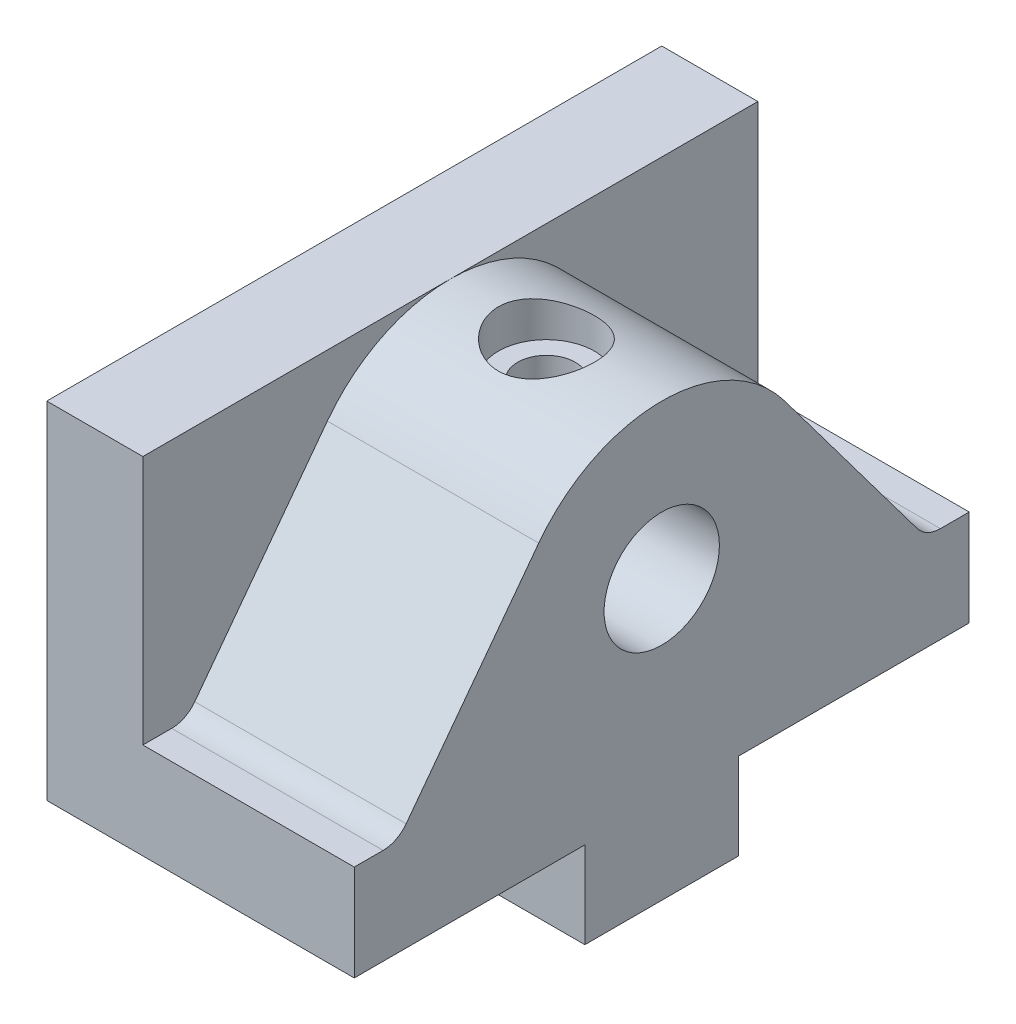
ISO-10303-21;
HEADER;
FILE_DESCRIPTION(('STEP AP214'),'2;1');
FILE_NAME('part.step','',(''),(''),'','','');
FILE_SCHEMA(('AUTOMOTIVE_DESIGN { 1 0 10303 214 1 1 1 1 }'));
ENDSEC;
DATA;
#1=APPLICATION_CONTEXT('core data for automotive mechanical design processes');
#2=APPLICATION_PROTOCOL_DEFINITION('international standard','automotive_design',2000,#1);
#3=PRODUCT_CONTEXT('',#1,'mechanical');
#4=PRODUCT('Part','Part','',(#3));
#5=PRODUCT_RELATED_PRODUCT_CATEGORY('part','',(#4));
#6=PRODUCT_DEFINITION_FORMATION('','',#4);
#7=PRODUCT_DEFINITION_CONTEXT('part definition',#1,'design');
#8=PRODUCT_DEFINITION('design','',#6,#7);
#9=PRODUCT_DEFINITION_SHAPE('','',#8);
#10=(LENGTH_UNIT() NAMED_UNIT(*) SI_UNIT(.MILLI.,.METRE.));
#11=(NAMED_UNIT(*) PLANE_ANGLE_UNIT() SI_UNIT($,.RADIAN.));
#12=(NAMED_UNIT(*) SI_UNIT($,.STERADIAN.) SOLID_ANGLE_UNIT());
#13=UNCERTAINTY_MEASURE_WITH_UNIT(LENGTH_MEASURE(1.E-05),#10,'distance_accuracy_value','');
#14=(GEOMETRIC_REPRESENTATION_CONTEXT(3) GLOBAL_UNCERTAINTY_ASSIGNED_CONTEXT((#13)) GLOBAL_UNIT_ASSIGNED_CONTEXT((#10,
#11,#12)) REPRESENTATION_CONTEXT('',''));
#15=CARTESIAN_POINT('',(0.,0.,0.));
#16=DIRECTION('',(0.,0.,1.));
#17=DIRECTION('',(1.,0.,0.));
#18=AXIS2_PLACEMENT_3D('',#15,#16,#17);
#19=CARTESIAN_POINT('',(-12.,-27.0010000000001,0.));
#20=DIRECTION('',(0.,1.,0.));
#21=DIRECTION('',(0.,0.,1.));
#22=AXIS2_PLACEMENT_3D('',#19,#20,#21);
#23=CYLINDRICAL_SURFACE('',#22,3.);
#24=CARTESIAN_POINT('',(-12.,7.19615242270666,2.99999999999989));
#25=CARTESIAN_POINT('',(-12.0782002332591,7.19615338151417,2.99999910875726));
#26=CARTESIAN_POINT('',(-12.1564099984646,7.19792581191128,2.99693611207792));
#27=CARTESIAN_POINT('',(-12.3122080751421,7.20493931657122,2.98473565374512));
#28=CARTESIAN_POINT('',(-12.3897960802685,7.21018200566082,2.9755953641163));
#29=CARTESIAN_POINT('',(-12.6209440142464,7.23088200558208,2.93916912258038));
#30=CARTESIAN_POINT('',(-12.7727509105332,7.25131076607218,2.90287805814901));
#31=CARTESIAN_POINT('',(-13.0663916335235,7.30247746927542,2.80829998089524));
#32=CARTESIAN_POINT('',(-13.2082738017509,7.33316051577919,2.75012989346617));
#33=CARTESIAN_POINT('',(-13.4802627617008,7.40128072966971,2.61380253964664));
#34=CARTESIAN_POINT('',(-13.610368915875,7.43871826241345,2.53564419197542));
#35=CARTESIAN_POINT('',(-13.8669201461478,7.51990583559836,2.35399963256541));
#36=CARTESIAN_POINT('',(-13.992178202156,7.56392184571631,2.24895611137365));
#37=CARTESIAN_POINT('',(-14.2242243696896,7.65115954702501,2.01976141989959));
#38=CARTESIAN_POINT('',(-14.3310032682567,7.69438083245622,1.89560077655241));
#39=CARTESIAN_POINT('',(-14.5301016877323,7.77864428988889,1.62146869109159));
#40=CARTESIAN_POINT('',(-14.6209613659273,7.81934318752246,1.47032156718993));
#41=CARTESIAN_POINT('',(-14.7754224974281,7.89052268800541,1.15247107964642));
#42=CARTESIAN_POINT('',(-14.8390411532465,7.92100973690812,0.985777614653127));
#43=CARTESIAN_POINT('',(-14.9325139979891,7.9664138360306,0.654134831556334));
#44=CARTESIAN_POINT('',(-14.9644485796481,7.98228440595575,0.489905370480219));
#45=CARTESIAN_POINT('',(-15.000498355444,8.00022751605261,0.15771188707928));
#46=CARTESIAN_POINT('',(-15.0046303821322,8.00230840492432,-0.0102498138109951));
#47=CARTESIAN_POINT('',(-14.9857599673651,7.99288945622735,-0.329497576667893));
#48=CARTESIAN_POINT('',(-14.965085911922,7.98255487247965,-0.480963609704571));
#49=CARTESIAN_POINT('',(-14.9013575098035,7.95122736207792,-0.777941303579809));
#50=CARTESIAN_POINT('',(-14.8583014884221,7.93023363786806,-0.923452517976575));
#51=CARTESIAN_POINT('',(-14.7507521442304,7.87914748253369,-1.20692822064058));
#52=CARTESIAN_POINT('',(-14.6859704687994,7.84893318545181,-1.34476044303));
#53=CARTESIAN_POINT('',(-14.5372103432921,7.78212944004645,-1.60793023199367));
#54=CARTESIAN_POINT('',(-14.4532250204903,7.7455377104437,-1.73326330217188));
#55=CARTESIAN_POINT('',(-14.2593115260604,7.66533158492097,-1.98052168794674));
#56=CARTESIAN_POINT('',(-14.1476814893584,7.62138031742823,-2.10100497271933));
#57=CARTESIAN_POINT('',(-13.9062402580912,7.53363118085846,-2.32231036115799));
#58=CARTESIAN_POINT('',(-13.7764152061043,7.48983345502616,-2.42311733790259));
#59=CARTESIAN_POINT('',(-13.4920178566593,7.40432084665527,-2.60852695463451));
#60=CARTESIAN_POINT('',(-13.336397564354,7.36291485750666,-2.69169402852802));
#61=CARTESIAN_POINT('',(-13.0924369453882,7.30915194408666,-2.79542837524199));
#62=CARTESIAN_POINT('',(-13.0093436895952,7.29261946495431,-2.82650797342001));
#63=CARTESIAN_POINT('',(-12.8401913969655,7.26298473463267,-2.88131297532037));
#64=CARTESIAN_POINT('',(-12.7541342255252,7.24988036897847,-2.90504291399193));
#65=CARTESIAN_POINT('',(-12.586628379776,7.22855455988387,-2.94323927983811));
#66=CARTESIAN_POINT('',(-12.5053505743621,7.22002982263212,-2.95828810706489));
#67=CARTESIAN_POINT('',(-12.3415647613341,7.20672737157292,-2.98163903200841));
#68=CARTESIAN_POINT('',(-12.2590574162517,7.20194770920409,-2.98994463830254));
#69=CARTESIAN_POINT('',(-12.0935289931973,7.19633662863607,-2.99968663811346));
#70=CARTESIAN_POINT('',(-12.0105081180563,7.19550374026212,-3.00112558946314));
#71=CARTESIAN_POINT('',(-11.8447135392353,7.19780953199967,-2.99712742537402));
#72=CARTESIAN_POINT('',(-11.7619398192495,7.20094794403251,-2.99169077406594));
#73=CARTESIAN_POINT('',(-11.5331408639573,7.21504493010251,-2.96710135231209));
#74=CARTESIAN_POINT('',(-11.3880891897367,7.23019160660501,-2.9405616310018));
#75=CARTESIAN_POINT('',(-11.1048690892031,7.27081666384495,-2.86709067362228));
#76=CARTESIAN_POINT('',(-10.9667029081698,7.29629839028759,-2.82015283383758));
#77=CARTESIAN_POINT('',(-10.6937738960801,7.35608780273026,-2.70494224478436));
#78=CARTESIAN_POINT('',(-10.5594650720959,7.39074960412728,-2.63578205088433));
#79=CARTESIAN_POINT('',(-10.303590061634,7.46468327792418,-2.47886133231342));
#80=CARTESIAN_POINT('',(-10.1820304691886,7.50395751387988,-2.39109125263827));
#81=CARTESIAN_POINT('',(-9.93906437336816,7.58864005140304,-2.18651145695807));
#82=CARTESIAN_POINT('',(-9.81960872910001,7.63419752084738,-2.06743580499406));
#83=CARTESIAN_POINT('',(-9.60176310470521,7.7220270231092,-1.81021349814981));
#84=CARTESIAN_POINT('',(-9.50338024032456,7.7642979430822,-1.67206042712514));
#85=CARTESIAN_POINT('',(-9.3282788724264,7.84224085806639,-1.37560608443378));
#86=CARTESIAN_POINT('',(-9.25220065811694,7.87770925226883,-1.21686929217556));
#87=CARTESIAN_POINT('',(-9.1285862756894,7.93650064667294,-0.886567094469558));
#88=CARTESIAN_POINT('',(-9.08102504515803,7.95983430919529,-0.715013103124007));
#89=CARTESIAN_POINT('',(-9.01989430815089,7.99002524645176,-0.380939047947182));
#90=CARTESIAN_POINT('',(-9.00360636443924,7.998197839307,-0.219034335650369));
#91=CARTESIAN_POINT('',(-8.99747021156646,8.0012639091934,0.105377961951248));
#92=CARTESIAN_POINT('',(-9.00761274681677,7.99616203476056,0.267885316317528));
#93=CARTESIAN_POINT('',(-9.05224919013346,7.97401907190636,0.577613962536207));
#94=CARTESIAN_POINT('',(-9.08509443766568,7.95778686442442,0.725136901247772));
#95=CARTESIAN_POINT('',(-9.17198110803209,7.91576278551446,1.01233790874445));
#96=CARTESIAN_POINT('',(-9.22602557054247,7.88996954319459,1.15201484923634));
#97=CARTESIAN_POINT('',(-9.35618072868872,7.82977801711603,1.4262700160517));
#98=CARTESIAN_POINT('',(-9.43313634153631,7.79505887623289,1.56037465678416));
#99=CARTESIAN_POINT('',(-9.60587542141361,7.72064363382007,1.81432469711306));
#100=CARTESIAN_POINT('',(-9.70166753598877,7.68094524943985,1.93416350676916));
#101=CARTESIAN_POINT('',(-9.92038472248357,7.59585978819435,2.16873884087785));
#102=CARTESIAN_POINT('',(-10.0450613207736,7.55029975504516,2.28178066887878));
#103=CARTESIAN_POINT('',(-10.3123783280702,7.46188649509677,2.48600225783029));
#104=CARTESIAN_POINT('',(-10.4550344610311,7.4190356875087,2.57716267726704));
#105=CARTESIAN_POINT('',(-10.6825317933018,7.36004774906987,2.69665559342489));
#106=CARTESIAN_POINT('',(-10.7619758009824,7.34101219148463,2.73405408762355));
#107=CARTESIAN_POINT('',(-10.9243532830087,7.30572783063718,2.80191257626506));
#108=CARTESIAN_POINT('',(-11.007284933748,7.28947759301443,2.83237614466585));
#109=CARTESIAN_POINT('',(-11.1758447323698,7.26045215868185,2.88592624586959));
#110=CARTESIAN_POINT('',(-11.2614653072414,7.24766803509091,2.90903175649396));
#111=CARTESIAN_POINT('',(-11.4348552553143,7.22608869625113,2.94762428051629));
#112=CARTESIAN_POINT('',(-11.5226230809207,7.21729069243667,2.96311662049618));
#113=CARTESIAN_POINT('',(-11.67539881776,7.20588528016135,2.9830938122572));
#114=CARTESIAN_POINT('',(-11.740094808907,7.20224442588138,2.98942746228383));
#115=CARTESIAN_POINT('',(-11.8698583167997,7.19737751744686,2.99788106792139));
#116=CARTESIAN_POINT('',(-11.9349258581076,7.19615162483722,3.00000074164537));
#117=CARTESIAN_POINT('',(-12.,7.19615242270666,2.99999999999989));
#118=B_SPLINE_CURVE_WITH_KNOTS('',3,(#24,#25,#26,#27,#28,#29,#30,#31,#32,#33,#34,#35,#36,#37,
#38,#39,#40,#41,#42,#43,#44,#45,#46,#47,#48,#49,#50,#51,#52,#53,#54,#55,#56,#57,#58,#59,#60,#61,
#62,#63,#64,#65,#66,#67,#68,#69,#70,#71,#72,#73,#74,#75,#76,#77,#78,#79,#80,#81,#82,#83,#84,#85,
#86,#87,#88,#89,#90,#91,#92,#93,#94,#95,#96,#97,#98,#99,#100,#101,#102,#103,#104,#105,#106,#107,
#108,#109,#110,#111,#112,#113,#114,#115,#116,#117),.UNSPECIFIED.,.T.,.F.,(4,2,2,2,2,2,2,2,2,2,2,
2,2,2,2,2,2,2,2,2,2,2,2,2,2,2,2,2,2,2,2,2,2,2,2,2,2,2,2,2,2,2,2,2,2,2,4),(0.,0.234529430733892,
0.469168072604248,0.93885038329448,1.40605749261239,1.87328988121656,2.37905864237583,
2.88507883741228,3.42520847204401,3.96499651379778,4.46637625391911,4.96745241546228,
5.42495462941722,5.88249108040471,6.34635774681547,6.81039068538924,7.3182874485878,
7.82657315225863,8.36713695676456,8.63752916119815,8.90775419202329,9.15669600787593,
9.40550821320573,9.65422772860786,9.90293045534218,10.3454331624118,10.7880792327729,
11.2512265518736,11.7146122462923,12.2364099671093,12.758383609037,13.2941331020799,
13.8294110539541,14.3155757713756,14.8015702635102,15.2555404058358,15.7095756650514,
16.1830301812752,16.6567025627126,17.177514915193,17.6987859450456,17.9680115893229,
18.2370981707631,18.5054849980179,18.7736837791728,18.9688338446807,19.1639969639894),.UNSPECIFIED.);
#119=CARTESIAN_POINT('',(-12.,7.19615242270666,2.99999999999989));
#120=VERTEX_POINT('',#119);
#121=EDGE_CURVE('E697',#120,#120,#118,.T.);
#122=ORIENTED_EDGE('',*,*,#121,.T.);
#123=EDGE_LOOP('',(#122));
#124=FACE_BOUND('',#123,.T.);
#125=CARTESIAN_POINT('',(-12.,14.,0.));
#126=DIRECTION('',(0.,1.,0.));
#127=DIRECTION('',(0.,0.,1.));
#128=AXIS2_PLACEMENT_3D('',#125,#126,#127);
#129=CIRCLE('',#128,3.);
#130=CARTESIAN_POINT('',(-12.,14.,3.));
#131=VERTEX_POINT('',#130);
#132=EDGE_CURVE('E699',#131,#131,#129,.F.);
#133=ORIENTED_EDGE('',*,*,#132,.F.);
#134=EDGE_LOOP('',(#133));
#135=FACE_BOUND('',#134,.T.);
#136=ADVANCED_FACE('F545',(#124,#135),#23,.F.);
#137=CARTESIAN_POINT('',(-32.,18.,-32.));
#138=DIRECTION('',(0.,0.,-1.));
#139=DIRECTION('',(-1.,0.,0.));
#140=AXIS2_PLACEMENT_3D('',#137,#138,#139);
#141=PLANE('',#140);
#142=DIRECTION('',(1.,0.,0.));
#143=VECTOR('',#142,1.);
#144=CARTESIAN_POINT('',(-32.,18.,-32.));
#145=LINE('',#144,#143);
#146=CARTESIAN_POINT('',(-32.,18.,-32.));
#147=VERTEX_POINT('',#146);
#148=CARTESIAN_POINT('',(-22.,18.,-32.));
#149=VERTEX_POINT('',#148);
#150=EDGE_CURVE('E977',#147,#149,#145,.T.);
#151=ORIENTED_EDGE('',*,*,#150,.T.);
#152=DIRECTION('',(0.,-1.,0.));
#153=VECTOR('',#152,1.);
#154=CARTESIAN_POINT('',(-22.,18.,-32.));
#155=LINE('',#154,#153);
#156=CARTESIAN_POINT('',(-22.,-8.00000000000001,-32.));
#157=VERTEX_POINT('',#156);
#158=EDGE_CURVE('E899',#149,#157,#155,.T.);
#159=ORIENTED_EDGE('',*,*,#158,.T.);
#160=DIRECTION('',(1.,0.,0.));
#161=VECTOR('',#160,1.);
#162=CARTESIAN_POINT('',(-22.,-8.00000000000001,-32.));
#163=LINE('',#162,#161);
#164=CARTESIAN_POINT('',(0.,-8.00000000000001,-32.));
#165=VERTEX_POINT('',#164);
#166=EDGE_CURVE('E874',#157,#165,#163,.T.);
#167=ORIENTED_EDGE('',*,*,#166,.T.);
#168=DIRECTION('',(0.,1.,0.));
#169=VECTOR('',#168,1.);
#170=CARTESIAN_POINT('',(0.,18.,-32.));
#171=LINE('',#170,#169);
#172=CARTESIAN_POINT('',(0.,-18.,-32.));
#173=VERTEX_POINT('',#172);
#174=EDGE_CURVE('E905',#173,#165,#171,.T.);
#175=ORIENTED_EDGE('',*,*,#174,.F.);
#176=DIRECTION('',(1.,0.,0.));
#177=VECTOR('',#176,1.);
#178=CARTESIAN_POINT('',(-32.,-18.,-32.));
#179=LINE('',#178,#177);
#180=CARTESIAN_POINT('',(-32.,-18.,-32.));
#181=VERTEX_POINT('',#180);
#182=EDGE_CURVE('E1009',#181,#173,#179,.T.);
#183=ORIENTED_EDGE('',*,*,#182,.F.);
#184=DIRECTION('',(0.,1.,0.));
#185=VECTOR('',#184,1.);
#186=CARTESIAN_POINT('',(-32.,18.,-32.));
#187=LINE('',#186,#185);
#188=EDGE_CURVE('E936',#181,#147,#187,.T.);
#189=ORIENTED_EDGE('',*,*,#188,.T.);
#190=EDGE_LOOP('',(#151,#159,#167,#175,#183,#189));
#191=FACE_BOUND('',#190,.T.);
#192=ADVANCED_FACE('F798',(#191),#141,.T.);
#193=CARTESIAN_POINT('',(-32.,18.,32.));
#194=DIRECTION('',(0.,1.,0.));
#195=DIRECTION('',(0.,0.,1.));
#196=AXIS2_PLACEMENT_3D('',#193,#194,#195);
#197=PLANE('',#196);
#198=DIRECTION('',(1.,0.,0.));
#199=VECTOR('',#198,1.);
#200=CARTESIAN_POINT('',(-32.,18.,32.));
#201=LINE('',#200,#199);
#202=CARTESIAN_POINT('',(-32.,18.,32.));
#203=VERTEX_POINT('',#202);
#204=CARTESIAN_POINT('',(-22.,18.,32.));
#205=VERTEX_POINT('',#204);
#206=EDGE_CURVE('E982',#203,#205,#201,.T.);
#207=ORIENTED_EDGE('',*,*,#206,.T.);
#208=DIRECTION('',(0.,0.,-1.));
#209=VECTOR('',#208,1.);
#210=CARTESIAN_POINT('',(-22.,18.,32.));
#211=LINE('',#210,#209);
#212=CARTESIAN_POINT('',(-22.,18.,0.));
#213=VERTEX_POINT('',#212);
#214=EDGE_CURVE('E733',#205,#213,#211,.T.);
#215=ORIENTED_EDGE('',*,*,#214,.T.);
#216=EDGE_CURVE('E1016',#213,#149,#211,.T.);
#217=ORIENTED_EDGE('',*,*,#216,.T.);
#218=ORIENTED_EDGE('',*,*,#150,.F.);
#219=DIRECTION('',(0.,0.,1.));
#220=VECTOR('',#219,1.);
#221=CARTESIAN_POINT('',(-32.,18.,32.));
#222=LINE('',#221,#220);
#223=EDGE_CURVE('E945',#147,#203,#222,.T.);
#224=ORIENTED_EDGE('',*,*,#223,.T.);
#225=EDGE_LOOP('',(#207,#215,#217,#218,#224));
#226=FACE_BOUND('',#225,.T.);
#227=ADVANCED_FACE('F769',(#226),#197,.T.);
#228=CARTESIAN_POINT('',(0.,0.,0.));
#229=DIRECTION('',(1.,0.,0.));
#230=DIRECTION('',(0.,0.,-1.));
#231=AXIS2_PLACEMENT_3D('',#228,#229,#230);
#232=PLANE('',#231);
#233=CARTESIAN_POINT('',(0.,2.,0.));
#234=DIRECTION('',(1.,0.,0.));
#235=DIRECTION('',(0.,0.,-1.));
#236=AXIS2_PLACEMENT_3D('',#233,#234,#235);
#237=CIRCLE('',#236,6.);
#238=CARTESIAN_POINT('',(0.,2.,-6.));
#239=VERTEX_POINT('',#238);
#240=EDGE_CURVE('E707',#239,#239,#237,.T.);
#241=ORIENTED_EDGE('',*,*,#240,.F.);
#242=EDGE_LOOP('',(#241));
#243=FACE_BOUND('',#242,.T.);
#244=DIRECTION('',(0.,0.,-1.));
#245=VECTOR('',#244,1.);
#246=CARTESIAN_POINT('',(0.,-8.00000000000001,32.));
#247=LINE('',#246,#245);
#248=CARTESIAN_POINT('',(0.,-8.00000000000001,32.));
#249=VERTEX_POINT('',#248);
#250=CARTESIAN_POINT('',(0.,-8.00000000000001,28.9999999999999));
#251=VERTEX_POINT('',#250);
#252=EDGE_CURVE('E848',#249,#251,#247,.T.);
#253=ORIENTED_EDGE('',*,*,#252,.F.);
#254=DIRECTION('',(0.,-1.,0.));
#255=VECTOR('',#254,1.);
#256=CARTESIAN_POINT('',(0.,18.,32.));
#257=LINE('',#256,#255);
#258=CARTESIAN_POINT('',(0.,-18.,32.));
#259=VERTEX_POINT('',#258);
#260=EDGE_CURVE('E907',#249,#259,#257,.T.);
#261=ORIENTED_EDGE('',*,*,#260,.T.);
#262=DIRECTION('',(0.,0.,-1.));
#263=VECTOR('',#262,1.);
#264=CARTESIAN_POINT('',(0.,-18.,32.));
#265=LINE('',#264,#263);
#266=CARTESIAN_POINT('',(0.,-18.,8.00000000000001));
#267=VERTEX_POINT('',#266);
#268=EDGE_CURVE('E915',#259,#267,#265,.T.);
#269=ORIENTED_EDGE('',*,*,#268,.T.);
#270=DIRECTION('',(0.,-1.,0.));
#271=VECTOR('',#270,1.);
#272=CARTESIAN_POINT('',(0.,-27.,8.00000000000001));
#273=LINE('',#272,#271);
#274=CARTESIAN_POINT('',(0.,-27.,8.00000000000001));
#275=VERTEX_POINT('',#274);
#276=EDGE_CURVE('E919',#267,#275,#273,.T.);
#277=ORIENTED_EDGE('',*,*,#276,.T.);
#278=DIRECTION('',(0.,0.,-1.));
#279=VECTOR('',#278,1.);
#280=CARTESIAN_POINT('',(0.,-27.,8.00000000000001));
#281=LINE('',#280,#279);
#282=CARTESIAN_POINT('',(0.,-27.,-8.00000000000001));
#283=VERTEX_POINT('',#282);
#284=EDGE_CURVE('E922',#275,#283,#281,.T.);
#285=ORIENTED_EDGE('',*,*,#284,.T.);
#286=DIRECTION('',(0.,1.,0.));
#287=VECTOR('',#286,1.);
#288=CARTESIAN_POINT('',(0.,-27.,-8.00000000000001));
#289=LINE('',#288,#287);
#290=CARTESIAN_POINT('',(0.,-18.,-8.00000000000001));
#291=VERTEX_POINT('',#290);
#292=EDGE_CURVE('E927',#283,#291,#289,.T.);
#293=ORIENTED_EDGE('',*,*,#292,.T.);
#294=DIRECTION('',(0.,0.,-1.));
#295=VECTOR('',#294,1.);
#296=CARTESIAN_POINT('',(0.,-18.,-8.00000000000001));
#297=LINE('',#296,#295);
#298=EDGE_CURVE('E933',#291,#173,#297,.T.);
#299=ORIENTED_EDGE('',*,*,#298,.T.);
#300=ORIENTED_EDGE('',*,*,#174,.T.);
#301=DIRECTION('',(0.,0.,-1.));
#302=VECTOR('',#301,1.);
#303=CARTESIAN_POINT('',(0.,-8.00000000000001,-27.5000000000001));
#304=LINE('',#303,#302);
#305=CARTESIAN_POINT('',(0.,-8.00000000000001,-28.9999999999999));
#306=VERTEX_POINT('',#305);
#307=EDGE_CURVE('E831',#306,#165,#304,.T.);
#308=ORIENTED_EDGE('',*,*,#307,.F.);
#309=CARTESIAN_POINT('',(0.,-5.,-28.9999999999999));
#310=DIRECTION('',(1.,0.,0.));
#311=DIRECTION('',(0.,0.,-1.));
#312=AXIS2_PLACEMENT_3D('',#309,#310,#311);
#313=CIRCLE('',#312,3.);
#314=CARTESIAN_POINT('',(0.,-6.80000000000003,-26.6));
#315=VERTEX_POINT('',#314);
#316=EDGE_CURVE('E552',#306,#315,#313,.F.);
#317=ORIENTED_EDGE('',*,*,#316,.T.);
#318=DIRECTION('',(0.,0.8,0.6));
#319=VECTOR('',#318,1.);
#320=CARTESIAN_POINT('',(0.,-8.00000000000001,-27.5000000000001));
#321=LINE('',#320,#319);
#322=CARTESIAN_POINT('',(0.,11.5999999999999,-12.7999999999999));
#323=VERTEX_POINT('',#322);
#324=EDGE_CURVE('E836',#315,#323,#321,.T.);
#325=ORIENTED_EDGE('',*,*,#324,.T.);
#326=CARTESIAN_POINT('',(0.,2.,0.));
#327=DIRECTION('',(1.,0.,0.));
#328=DIRECTION('',(0.,0.,-1.));
#329=AXIS2_PLACEMENT_3D('',#326,#327,#328);
#330=CIRCLE('',#329,16.);
#331=CARTESIAN_POINT('',(0.,11.5999999999999,12.7999999999999));
#332=VERTEX_POINT('',#331);
#333=EDGE_CURVE('E1012',#323,#332,#330,.T.);
#334=ORIENTED_EDGE('',*,*,#333,.T.);
#335=DIRECTION('',(0.,0.8,-0.600000000000001));
#336=VECTOR('',#335,1.);
#337=CARTESIAN_POINT('',(0.,-8.00000000000001,27.5000000000001));
#338=LINE('',#337,#336);
#339=CARTESIAN_POINT('',(0.,-6.80000000000003,26.6));
#340=VERTEX_POINT('',#339);
#341=EDGE_CURVE('E845',#340,#332,#338,.T.);
#342=ORIENTED_EDGE('',*,*,#341,.F.);
#343=CARTESIAN_POINT('',(0.,-5.,28.9999999999999));
#344=DIRECTION('',(1.,0.,0.));
#345=DIRECTION('',(0.,0.,-1.));
#346=AXIS2_PLACEMENT_3D('',#343,#344,#345);
#347=CIRCLE('',#346,3.);
#348=EDGE_CURVE('E13',#340,#251,#347,.F.);
#349=ORIENTED_EDGE('',*,*,#348,.T.);
#350=EDGE_LOOP('',(#253,#261,#269,#277,#285,#293,#299,#300,#308,#317,#325,#334,#342,#349));
#351=FACE_BOUND('',#350,.T.);
#352=ADVANCED_FACE('F766',(#243,#351),#232,.T.);
#353=CARTESIAN_POINT('',(-32.,-18.,-8.00000000000001));
#354=DIRECTION('',(0.,-1.,0.));
#355=DIRECTION('',(0.,0.,-1.));
#356=AXIS2_PLACEMENT_3D('',#353,#354,#355);
#357=PLANE('',#356);
#358=ORIENTED_EDGE('',*,*,#298,.F.);
#359=DIRECTION('',(1.,0.,0.));
#360=VECTOR('',#359,1.);
#361=CARTESIAN_POINT('',(-32.,-18.,-8.00000000000001));
#362=LINE('',#361,#360);
#363=CARTESIAN_POINT('',(-32.,-18.,-8.00000000000001));
#364=VERTEX_POINT('',#363);
#365=EDGE_CURVE('E1004',#364,#291,#362,.T.);
#366=ORIENTED_EDGE('',*,*,#365,.F.);
#367=DIRECTION('',(0.,0.,-1.));
#368=VECTOR('',#367,1.);
#369=CARTESIAN_POINT('',(-32.,-18.,-8.00000000000001));
#370=LINE('',#369,#368);
#371=EDGE_CURVE('E974',#364,#181,#370,.T.);
#372=ORIENTED_EDGE('',*,*,#371,.T.);
#373=ORIENTED_EDGE('',*,*,#182,.T.);
#374=EDGE_LOOP('',(#358,#366,#372,#373));
#375=FACE_BOUND('',#374,.T.);
#376=ADVANCED_FACE('F768',(#375),#357,.T.);
#377=CARTESIAN_POINT('',(-32.,-27.,-8.00000000000001));
#378=DIRECTION('',(0.,0.,-1.));
#379=DIRECTION('',(0.,1.,0.));
#380=AXIS2_PLACEMENT_3D('',#377,#378,#379);
#381=PLANE('',#380);
#382=ORIENTED_EDGE('',*,*,#292,.F.);
#383=DIRECTION('',(1.,0.,0.));
#384=VECTOR('',#383,1.);
#385=CARTESIAN_POINT('',(-32.,-27.,-8.00000000000001));
#386=LINE('',#385,#384);
#387=CARTESIAN_POINT('',(-32.,-27.,-8.00000000000001));
#388=VERTEX_POINT('',#387);
#389=EDGE_CURVE('E1003',#388,#283,#386,.T.);
#390=ORIENTED_EDGE('',*,*,#389,.F.);
#391=DIRECTION('',(0.,1.,0.));
#392=VECTOR('',#391,1.);
#393=CARTESIAN_POINT('',(-32.,-27.,-8.00000000000001));
#394=LINE('',#393,#392);
#395=EDGE_CURVE('E970',#388,#364,#394,.T.);
#396=ORIENTED_EDGE('',*,*,#395,.T.);
#397=ORIENTED_EDGE('',*,*,#365,.T.);
#398=EDGE_LOOP('',(#382,#390,#396,#397));
#399=FACE_BOUND('',#398,.T.);
#400=ADVANCED_FACE('F771',(#399),#381,.T.);
#401=CARTESIAN_POINT('',(-32.,-27.,8.00000000000001));
#402=DIRECTION('',(0.,-1.,0.));
#403=DIRECTION('',(0.,0.,-1.));
#404=AXIS2_PLACEMENT_3D('',#401,#402,#403);
#405=PLANE('',#404);
#406=CARTESIAN_POINT('',(-8.00000000000001,-27.,0.));
#407=DIRECTION('',(0.,-1.,0.));
#408=DIRECTION('',(0.,0.,-1.));
#409=AXIS2_PLACEMENT_3D('',#406,#407,#408);
#410=CIRCLE('',#409,3.025);
#411=CARTESIAN_POINT('',(-8.00000000000001,-27.,-3.025));
#412=VERTEX_POINT('',#411);
#413=EDGE_CURVE('E685',#412,#412,#410,.T.);
#414=ORIENTED_EDGE('',*,*,#413,.F.);
#415=EDGE_LOOP('',(#414));
#416=FACE_BOUND('',#415,.T.);
#417=CARTESIAN_POINT('',(-24.,-27.,0.));
#418=DIRECTION('',(0.,-1.,0.));
#419=DIRECTION('',(0.,0.,-1.));
#420=AXIS2_PLACEMENT_3D('',#417,#418,#419);
#421=CIRCLE('',#420,3.025);
#422=CARTESIAN_POINT('',(-24.,-27.,-3.025));
#423=VERTEX_POINT('',#422);
#424=EDGE_CURVE('E672',#423,#423,#421,.T.);
#425=ORIENTED_EDGE('',*,*,#424,.F.);
#426=EDGE_LOOP('',(#425));
#427=FACE_BOUND('',#426,.T.);
#428=ORIENTED_EDGE('',*,*,#284,.F.);
#429=DIRECTION('',(1.,0.,0.));
#430=VECTOR('',#429,1.);
#431=CARTESIAN_POINT('',(-32.,-27.,8.00000000000001));
#432=LINE('',#431,#430);
#433=CARTESIAN_POINT('',(-32.,-27.,8.00000000000001));
#434=VERTEX_POINT('',#433);
#435=EDGE_CURVE('E999',#434,#275,#432,.T.);
#436=ORIENTED_EDGE('',*,*,#435,.F.);
#437=DIRECTION('',(0.,0.,-1.));
#438=VECTOR('',#437,1.);
#439=CARTESIAN_POINT('',(-32.,-27.,8.00000000000001));
#440=LINE('',#439,#438);
#441=EDGE_CURVE('E962',#434,#388,#440,.T.);
#442=ORIENTED_EDGE('',*,*,#441,.T.);
#443=ORIENTED_EDGE('',*,*,#389,.T.);
#444=EDGE_LOOP('',(#428,#436,#442,#443));
#445=FACE_BOUND('',#444,.T.);
#446=ADVANCED_FACE('F777',(#416,#427,#445),#405,.T.);
#447=CARTESIAN_POINT('',(-32.,-27.,8.00000000000001));
#448=DIRECTION('',(0.,0.,1.));
#449=DIRECTION('',(0.,-1.,0.));
#450=AXIS2_PLACEMENT_3D('',#447,#448,#449);
#451=PLANE('',#450);
#452=ORIENTED_EDGE('',*,*,#276,.F.);
#453=DIRECTION('',(1.,0.,0.));
#454=VECTOR('',#453,1.);
#455=CARTESIAN_POINT('',(-32.,-18.,8.00000000000001));
#456=LINE('',#455,#454);
#457=CARTESIAN_POINT('',(-32.,-18.,8.00000000000001));
#458=VERTEX_POINT('',#457);
#459=EDGE_CURVE('E994',#458,#267,#456,.T.);
#460=ORIENTED_EDGE('',*,*,#459,.F.);
#461=DIRECTION('',(0.,-1.,0.));
#462=VECTOR('',#461,1.);
#463=CARTESIAN_POINT('',(-32.,-27.,8.00000000000001));
#464=LINE('',#463,#462);
#465=EDGE_CURVE('E960',#458,#434,#464,.T.);
#466=ORIENTED_EDGE('',*,*,#465,.T.);
#467=ORIENTED_EDGE('',*,*,#435,.T.);
#468=EDGE_LOOP('',(#452,#460,#466,#467));
#469=FACE_BOUND('',#468,.T.);
#470=ADVANCED_FACE('F785',(#469),#451,.T.);
#471=CARTESIAN_POINT('',(-32.,-18.,32.));
#472=DIRECTION('',(0.,-1.,0.));
#473=DIRECTION('',(0.,0.,-1.));
#474=AXIS2_PLACEMENT_3D('',#471,#472,#473);
#475=PLANE('',#474);
#476=ORIENTED_EDGE('',*,*,#268,.F.);
#477=DIRECTION('',(1.,0.,0.));
#478=VECTOR('',#477,1.);
#479=CARTESIAN_POINT('',(-32.,-18.,32.));
#480=LINE('',#479,#478);
#481=CARTESIAN_POINT('',(-32.,-18.,32.));
#482=VERTEX_POINT('',#481);
#483=EDGE_CURVE('E988',#482,#259,#480,.T.);
#484=ORIENTED_EDGE('',*,*,#483,.F.);
#485=DIRECTION('',(0.,0.,-1.));
#486=VECTOR('',#485,1.);
#487=CARTESIAN_POINT('',(-32.,-18.,32.));
#488=LINE('',#487,#486);
#489=EDGE_CURVE('E954',#482,#458,#488,.T.);
#490=ORIENTED_EDGE('',*,*,#489,.T.);
#491=ORIENTED_EDGE('',*,*,#459,.T.);
#492=EDGE_LOOP('',(#476,#484,#490,#491));
#493=FACE_BOUND('',#492,.T.);
#494=ADVANCED_FACE('F787',(#493),#475,.T.);
#495=CARTESIAN_POINT('',(-32.,18.,32.));
#496=DIRECTION('',(0.,0.,1.));
#497=DIRECTION('',(1.,0.,0.));
#498=AXIS2_PLACEMENT_3D('',#495,#496,#497);
#499=PLANE('',#498);
#500=DIRECTION('',(1.,0.,0.));
#501=VECTOR('',#500,1.);
#502=CARTESIAN_POINT('',(-22.,-8.00000000000001,32.));
#503=LINE('',#502,#501);
#504=CARTESIAN_POINT('',(-22.,-8.00000000000001,32.));
#505=VERTEX_POINT('',#504);
#506=EDGE_CURVE('E886',#505,#249,#503,.T.);
#507=ORIENTED_EDGE('',*,*,#506,.F.);
#508=DIRECTION('',(0.,1.,0.));
#509=VECTOR('',#508,1.);
#510=CARTESIAN_POINT('',(-22.,18.,32.));
#511=LINE('',#510,#509);
#512=EDGE_CURVE('E892',#505,#205,#511,.T.);
#513=ORIENTED_EDGE('',*,*,#512,.T.);
#514=ORIENTED_EDGE('',*,*,#206,.F.);
#515=DIRECTION('',(0.,-1.,0.));
#516=VECTOR('',#515,1.);
#517=CARTESIAN_POINT('',(-32.,18.,32.));
#518=LINE('',#517,#516);
#519=EDGE_CURVE('E947',#203,#482,#518,.T.);
#520=ORIENTED_EDGE('',*,*,#519,.T.);
#521=ORIENTED_EDGE('',*,*,#483,.T.);
#522=ORIENTED_EDGE('',*,*,#260,.F.);
#523=EDGE_LOOP('',(#507,#513,#514,#520,#521,#522));
#524=FACE_BOUND('',#523,.T.);
#525=ADVANCED_FACE('F762',(#524),#499,.T.);
#526=CARTESIAN_POINT('',(-32.,0.,0.));
#527=DIRECTION('',(1.,0.,0.));
#528=DIRECTION('',(0.,0.,-1.));
#529=AXIS2_PLACEMENT_3D('',#526,#527,#528);
#530=PLANE('',#529);
#531=ORIENTED_EDGE('',*,*,#188,.F.);
#532=ORIENTED_EDGE('',*,*,#371,.F.);
#533=ORIENTED_EDGE('',*,*,#395,.F.);
#534=ORIENTED_EDGE('',*,*,#441,.F.);
#535=ORIENTED_EDGE('',*,*,#465,.F.);
#536=ORIENTED_EDGE('',*,*,#489,.F.);
#537=ORIENTED_EDGE('',*,*,#519,.F.);
#538=ORIENTED_EDGE('',*,*,#223,.F.);
#539=EDGE_LOOP('',(#531,#532,#533,#534,#535,#536,#537,#538));
#540=FACE_BOUND('',#539,.T.);
#541=ADVANCED_FACE('F761',(#540),#530,.F.);
#542=CARTESIAN_POINT('',(-22.,0.,0.));
#543=DIRECTION('',(1.,0.,0.));
#544=DIRECTION('',(0.,0.,-1.));
#545=AXIS2_PLACEMENT_3D('',#542,#543,#544);
#546=PLANE('',#545);
#547=DIRECTION('',(0.,0.8,0.6));
#548=VECTOR('',#547,1.);
#549=CARTESIAN_POINT('',(-22.,-8.00000000000001,-27.5000000000001));
#550=LINE('',#549,#548);
#551=CARTESIAN_POINT('',(-22.,-6.80000000000003,-26.6));
#552=VERTEX_POINT('',#551);
#553=CARTESIAN_POINT('',(-22.,11.5999999999999,-12.7999999999999));
#554=VERTEX_POINT('',#553);
#555=EDGE_CURVE('E852',#552,#554,#550,.T.);
#556=ORIENTED_EDGE('',*,*,#555,.F.);
#557=CARTESIAN_POINT('',(-22.,-5.,-28.9999999999999));
#558=DIRECTION('',(1.,0.,0.));
#559=DIRECTION('',(0.,0.,-1.));
#560=AXIS2_PLACEMENT_3D('',#557,#558,#559);
#561=CIRCLE('',#560,3.);
#562=CARTESIAN_POINT('',(-22.,-8.00000000000001,-28.9999999999999));
#563=VERTEX_POINT('',#562);
#564=EDGE_CURVE('E1033',#552,#563,#561,.T.);
#565=ORIENTED_EDGE('',*,*,#564,.T.);
#566=DIRECTION('',(0.,0.,-1.));
#567=VECTOR('',#566,1.);
#568=CARTESIAN_POINT('',(-22.,-8.00000000000001,-27.5000000000001));
#569=LINE('',#568,#567);
#570=EDGE_CURVE('E846',#563,#157,#569,.T.);
#571=ORIENTED_EDGE('',*,*,#570,.T.);
#572=ORIENTED_EDGE('',*,*,#158,.F.);
#573=ORIENTED_EDGE('',*,*,#216,.F.);
#574=CARTESIAN_POINT('',(-22.,2.,0.));
#575=DIRECTION('',(1.,0.,0.));
#576=DIRECTION('',(0.,0.,-1.));
#577=AXIS2_PLACEMENT_3D('',#574,#575,#576);
#578=CIRCLE('',#577,16.);
#579=EDGE_CURVE('E861',#554,#213,#578,.T.);
#580=ORIENTED_EDGE('',*,*,#579,.F.);
#581=EDGE_LOOP('',(#556,#565,#571,#572,#573,#580));
#582=FACE_BOUND('',#581,.T.);
#583=ADVANCED_FACE('F742',(#582),#546,.T.);
#584=CARTESIAN_POINT('',(-22.,2.,0.));
#585=DIRECTION('',(1.,0.,0.));
#586=DIRECTION('',(0.,0.,-1.));
#587=AXIS2_PLACEMENT_3D('',#584,#585,#586);
#588=CYLINDRICAL_SURFACE('',#587,16.);
#589=CARTESIAN_POINT('',(-12.,17.1986841535707,4.99999999999989));
#590=CARTESIAN_POINT('',(-11.7266118555484,17.1986858388479,4.99999815120841));
#591=CARTESIAN_POINT('',(-11.4532049251834,17.206141260301,4.9775015516615));
#592=CARTESIAN_POINT('',(-10.9144233564926,17.2350255598558,4.88836701605134));
#593=CARTESIAN_POINT('',(-10.6490509090723,17.2564582140989,4.82171715130021));
#594=CARTESIAN_POINT('',(-10.134220392271,17.310637553465,4.6467915289429));
#595=CARTESIAN_POINT('',(-9.88473506757702,17.3433642077798,4.53858942946722));
#596=CARTESIAN_POINT('',(-9.40738921654426,17.4164162487404,4.28387656692614));
#597=CARTESIAN_POINT('',(-9.17953252015963,17.4567429774317,4.13735903622526));
#598=CARTESIAN_POINT('',(-8.74408453002602,17.5420051067468,3.80478428248925));
#599=CARTESIAN_POINT('',(-8.53734556225608,17.5870449353918,3.61763759888164));
#600=CARTESIAN_POINT('',(-8.15761594716331,17.6757698344129,3.21144818582199));
#601=CARTESIAN_POINT('',(-7.98463001222063,17.7194547149049,2.99240101007427));
#602=CARTESIAN_POINT('',(-7.67355574795503,17.8017421356032,2.52250364997346));
#603=CARTESIAN_POINT('',(-7.53634518467421,17.8402073825112,2.2710462260804));
#604=CARTESIAN_POINT('',(-7.30649580057782,17.9065020733208,1.74721693141366));
#605=CARTESIAN_POINT('',(-7.21384650340165,17.9343340167969,1.47484999394828));
#606=CARTESIAN_POINT('',(-7.07859548761171,17.9754870328346,0.925857427864458));
#607=CARTESIAN_POINT('',(-7.03453700084861,17.9892295593657,0.649622861872899));
#608=CARTESIAN_POINT('',(-6.99310261424991,18.0021438350406,0.0933632559380611));
#609=CARTESIAN_POINT('',(-6.99571610256465,18.0013188964028,-0.186660907892384));
#610=CARTESIAN_POINT('',(-7.04659316634372,17.9854846453013,-0.732297921418966));
#611=CARTESIAN_POINT('',(-7.09327753405201,17.9709660388855,-0.998074537256151));
#612=CARTESIAN_POINT('',(-7.2283799601721,17.929979302435,-1.51781225339111));
#613=CARTESIAN_POINT('',(-7.3168007403465,17.9035103930884,-1.77177258192492));
#614=CARTESIAN_POINT('',(-7.53388075629922,17.8409383891783,-2.26431241261892));
#615=CARTESIAN_POINT('',(-7.66301923425099,17.8047213446668,-2.50266562249067));
#616=CARTESIAN_POINT('',(-7.95748439881933,17.726468918154,-2.95481004460867));
#617=CARTESIAN_POINT('',(-8.12282023655547,17.6844320658262,-3.16859502483756));
#618=CARTESIAN_POINT('',(-8.49309453920083,17.5969468293413,-3.57495079381308));
#619=CARTESIAN_POINT('',(-8.69939627534833,17.5514292793938,-3.76626619636761));
#620=CARTESIAN_POINT('',(-9.14158040731423,17.4636246177861,-4.11195897039052));
#621=CARTESIAN_POINT('',(-9.37746628236139,17.4213378870278,-4.26633199104745));
#622=CARTESIAN_POINT('',(-9.87566987539026,17.3444338653156,-4.53521860076329));
#623=CARTESIAN_POINT('',(-10.1382536359638,17.3099076117638,-4.64926722799053));
#624=CARTESIAN_POINT('',(-10.680237967368,17.2535018111541,-4.83113383782181));
#625=CARTESIAN_POINT('',(-10.9596324567775,17.2316177207006,-4.89896843059998));
#626=CARTESIAN_POINT('',(-11.5152798103086,17.2039825362817,-4.98405940745612));
#627=CARTESIAN_POINT('',(-11.7912079849405,17.1976186557503,-5.00323817415585));
#628=CARTESIAN_POINT('',(-12.3423589659805,17.200043098397,-4.99586977992486));
#629=CARTESIAN_POINT('',(-12.6175818747986,17.2088290802927,-4.96932968445631));
#630=CARTESIAN_POINT('',(-13.1512331866096,17.2399582993567,-4.87299494052768));
#631=CARTESIAN_POINT('',(-13.4099170962968,17.2619021640805,-4.80447324642203));
#632=CARTESIAN_POINT('',(-13.9120871679833,17.3164514932552,-4.6276149464406));
#633=CARTESIAN_POINT('',(-14.1555708436846,17.3490586964924,-4.51927184684608));
#634=CARTESIAN_POINT('',(-14.6281564390873,17.4224215861293,-4.26230042623517));
#635=CARTESIAN_POINT('',(-14.8566456623712,17.4633841395902,-4.11260589954235));
#636=CARTESIAN_POINT('',(-15.2859613854476,17.5484139589123,-3.7784256347192));
#637=CARTESIAN_POINT('',(-15.4867806757013,17.5924820294277,-3.59393085876311));
#638=CARTESIAN_POINT('',(-15.8636414636513,17.6809675025072,-3.18629179101441));
#639=CARTESIAN_POINT('',(-16.0383111445595,17.7253236914272,-2.96186259915407));
#640=CARTESIAN_POINT('',(-16.347564173285,17.8075623937471,-2.48580618260558));
#641=CARTESIAN_POINT('',(-16.4821493572442,17.845445203638,-2.23418020443448));
#642=CARTESIAN_POINT('',(-16.7061222498867,17.9102524771406,-1.71242209332732));
#643=CARTESIAN_POINT('',(-16.7958371513747,17.937255982448,-1.44244073713502));
#644=CARTESIAN_POINT('',(-16.9282901543588,17.977609705943,-0.890229016225562));
#645=CARTESIAN_POINT('',(-16.971042956334,17.9909641965712,-0.60800251336143));
#646=CARTESIAN_POINT('',(-17.0071640069985,18.0022321361783,-0.0519397465956332));
#647=CARTESIAN_POINT('',(-17.0025138006831,18.0007651762951,0.221756767786019));
#648=CARTESIAN_POINT('',(-16.9487527558052,17.9840391232424,0.764292887692986));
#649=CARTESIAN_POINT('',(-16.899644816032,17.9687809293065,1.03313280871836));
#650=CARTESIAN_POINT('',(-16.7596239631111,17.9263828337902,1.55502047392297));
#651=CARTESIAN_POINT('',(-16.6692415686192,17.899393918402,1.80822367379736));
#652=CARTESIAN_POINT('',(-16.4497166911655,17.8363178235242,2.2959937020008));
#653=CARTESIAN_POINT('',(-16.3205675601038,17.8002290836774,2.53055732509973));
#654=CARTESIAN_POINT('',(-16.0221089666249,17.7211958753112,2.98304677987679));
#655=CARTESIAN_POINT('',(-15.851585910154,17.678060389948,3.20013842820511));
#656=CARTESIAN_POINT('',(-15.4773604422163,17.590349461973,3.60328316560464));
#657=CARTESIAN_POINT('',(-15.2736481034056,17.5457735917314,3.78932693404407));
#658=CARTESIAN_POINT('',(-14.8307371206702,17.458475702747,4.13131463642463));
#659=CARTESIAN_POINT('',(-14.5905863876706,17.4158640332117,4.28605711968623));
#660=CARTESIAN_POINT('',(-14.0864075190499,17.3392050100618,4.55281882984166));
#661=CARTESIAN_POINT('',(-13.8223890942127,17.3051541945184,4.66485533612207));
#662=CARTESIAN_POINT('',(-13.3011095307251,17.2522624175553,4.83484721745078));
#663=CARTESIAN_POINT('',(-13.0451898102441,17.2323726005924,4.89659759350262));
#664=CARTESIAN_POINT('',(-12.5261846716844,17.2055842579893,4.97916983261894));
#665=CARTESIAN_POINT('',(-12.2631010352178,17.1986825317075,5.00000177922465));
#666=CARTESIAN_POINT('',(-12.,17.1986841535707,4.99999999999989));
#667=B_SPLINE_CURVE_WITH_KNOTS('',3,(#589,#590,#591,#592,#593,#594,#595,#596,#597,#598,#599,
#600,#601,#602,#603,#604,#605,#606,#607,#608,#609,#610,#611,#612,#613,#614,#615,#616,#617,#618,
#619,#620,#621,#622,#623,#624,#625,#626,#627,#628,#629,#630,#631,#632,#633,#634,#635,#636,#637,
#638,#639,#640,#641,#642,#643,#644,#645,#646,#647,#648,#649,#650,#651,#652,#653,#654,#655,#656,
#657,#658,#659,#660,#661,#662,#663,#664,#665,#666),.UNSPECIFIED.,.T.,.F.,(4,2,2,2,2,2,2,2,2,2,2,
2,2,2,2,2,2,2,2,2,2,2,2,2,2,2,2,2,2,2,2,2,2,2,2,2,2,2,4),(0.,0.819192550193983,1.63860650823898,
2.45657457647431,3.27468721969974,4.11828322203349,4.96199691764489,5.82479287854929,
6.68738589671682,7.52334891342135,8.35912185887105,9.16603931879005,9.97300940760371,
10.7898561843363,11.6069097085274,12.4580135574933,13.309217594151,14.1699388374228,
15.0303505582074,15.8561973316147,16.6819164888608,17.4837588818718,18.2857320902257,
19.1107045324817,19.9358915205725,20.7952775125577,21.6546241327808,22.5076095717372,
23.3603279257207,24.1775520976783,24.9947229877895,25.8016738606876,26.6087631965633,
27.4432277243059,28.277942310985,29.1403118201789,30.002332032282,30.7908941750129,
31.5792619677388),.UNSPECIFIED.);
#668=CARTESIAN_POINT('',(-12.,17.1986841535707,4.99999999999989));
#669=VERTEX_POINT('',#668);
#670=EDGE_CURVE('E721',#669,#669,#667,.T.);
#671=ORIENTED_EDGE('',*,*,#670,.F.);
#672=EDGE_LOOP('',(#671));
#673=FACE_BOUND('',#672,.T.);
#674=ORIENTED_EDGE('',*,*,#579,.T.);
#675=CARTESIAN_POINT('',(-22.,11.5999999999999,12.7999999999999));
#676=VERTEX_POINT('',#675);
#677=EDGE_CURVE('E856',#213,#676,#578,.T.);
#678=ORIENTED_EDGE('',*,*,#677,.T.);
#679=DIRECTION('',(1.,0.,0.));
#680=VECTOR('',#679,1.);
#681=CARTESIAN_POINT('',(-22.,11.5999999999999,12.7999999999999));
#682=LINE('',#681,#680);
#683=EDGE_CURVE('E883',#676,#332,#682,.T.);
#684=ORIENTED_EDGE('',*,*,#683,.T.);
#685=ORIENTED_EDGE('',*,*,#333,.F.);
#686=DIRECTION('',(1.,0.,0.));
#687=VECTOR('',#686,1.);
#688=CARTESIAN_POINT('',(-22.,11.5999999999999,-12.7999999999999));
#689=LINE('',#688,#687);
#690=EDGE_CURVE('E879',#554,#323,#689,.T.);
#691=ORIENTED_EDGE('',*,*,#690,.F.);
#692=EDGE_LOOP('',(#674,#678,#684,#685,#691));
#693=FACE_BOUND('',#692,.T.);
#694=ADVANCED_FACE('F737',(#673,#693),#588,.T.);
#695=DIRECTION('',(0.,0.,-1.));
#696=VECTOR('',#695,1.);
#697=CARTESIAN_POINT('',(-22.,-8.00000000000001,32.));
#698=LINE('',#697,#696);
#699=CARTESIAN_POINT('',(-22.,-8.00000000000001,28.9999999999999));
#700=VERTEX_POINT('',#699);
#701=EDGE_CURVE('E871',#505,#700,#698,.T.);
#702=ORIENTED_EDGE('',*,*,#701,.T.);
#703=CARTESIAN_POINT('',(-22.,-5.,28.9999999999999));
#704=DIRECTION('',(1.,0.,0.));
#705=DIRECTION('',(0.,0.,-1.));
#706=AXIS2_PLACEMENT_3D('',#703,#704,#705);
#707=CIRCLE('',#706,3.);
#708=CARTESIAN_POINT('',(-22.,-6.80000000000003,26.6));
#709=VERTEX_POINT('',#708);
#710=EDGE_CURVE('E1043',#700,#709,#707,.T.);
#711=ORIENTED_EDGE('',*,*,#710,.T.);
#712=DIRECTION('',(0.,0.8,-0.600000000000001));
#713=VECTOR('',#712,1.);
#714=CARTESIAN_POINT('',(-22.,-8.00000000000001,27.5000000000001));
#715=LINE('',#714,#713);
#716=EDGE_CURVE('E868',#709,#676,#715,.T.);
#717=ORIENTED_EDGE('',*,*,#716,.T.);
#718=ORIENTED_EDGE('',*,*,#677,.F.);
#719=ORIENTED_EDGE('',*,*,#214,.F.);
#720=ORIENTED_EDGE('',*,*,#512,.F.);
#721=EDGE_LOOP('',(#702,#711,#717,#718,#719,#720));
#722=FACE_BOUND('',#721,.T.);
#723=ADVANCED_FACE('F741',(#722),#546,.T.);
#724=CARTESIAN_POINT('',(-22.,-8.00000000000001,32.));
#725=DIRECTION('',(0.,-1.,0.));
#726=DIRECTION('',(0.,0.,-1.));
#727=AXIS2_PLACEMENT_3D('',#724,#725,#726);
#728=PLANE('',#727);
#729=ORIENTED_EDGE('',*,*,#252,.T.);
#730=DIRECTION('',(1.,0.,0.));
#731=VECTOR('',#730,1.);
#732=CARTESIAN_POINT('',(-22.,-8.00000000000001,28.9999999999999));
#733=LINE('',#732,#731);
#734=EDGE_CURVE('E557',#251,#700,#733,.F.);
#735=ORIENTED_EDGE('',*,*,#734,.T.);
#736=ORIENTED_EDGE('',*,*,#701,.F.);
#737=ORIENTED_EDGE('',*,*,#506,.T.);
#738=EDGE_LOOP('',(#729,#735,#736,#737));
#739=FACE_BOUND('',#738,.T.);
#740=ADVANCED_FACE('F757',(#739),#728,.F.);
#741=CARTESIAN_POINT('',(-22.,-8.00000000000001,27.5000000000001));
#742=DIRECTION('',(0.,-0.6,-0.8));
#743=DIRECTION('',(0.,0.8,-0.6));
#744=AXIS2_PLACEMENT_3D('',#741,#742,#743);
#745=PLANE('',#744);
#746=ORIENTED_EDGE('',*,*,#716,.F.);
#747=DIRECTION('',(1.,0.,0.));
#748=VECTOR('',#747,1.);
#749=CARTESIAN_POINT('',(0.,-6.80000000000003,26.6));
#750=LINE('',#749,#748);
#751=EDGE_CURVE('E1036',#709,#340,#750,.T.);
#752=ORIENTED_EDGE('',*,*,#751,.T.);
#753=ORIENTED_EDGE('',*,*,#341,.T.);
#754=ORIENTED_EDGE('',*,*,#683,.F.);
#755=EDGE_LOOP('',(#746,#752,#753,#754));
#756=FACE_BOUND('',#755,.T.);
#757=ADVANCED_FACE('F748',(#756),#745,.F.);
#758=CARTESIAN_POINT('',(-22.,-8.00000000000001,-27.5000000000001));
#759=DIRECTION('',(0.,0.6,-0.8));
#760=DIRECTION('',(0.,0.8,0.6));
#761=AXIS2_PLACEMENT_3D('',#758,#759,#760);
#762=PLANE('',#761);
#763=ORIENTED_EDGE('',*,*,#324,.F.);
#764=DIRECTION('',(1.,0.,0.));
#765=VECTOR('',#764,1.);
#766=CARTESIAN_POINT('',(-22.,-6.80000000000003,-26.6));
#767=LINE('',#766,#765);
#768=EDGE_CURVE('E1027',#315,#552,#767,.F.);
#769=ORIENTED_EDGE('',*,*,#768,.T.);
#770=ORIENTED_EDGE('',*,*,#555,.T.);
#771=ORIENTED_EDGE('',*,*,#690,.T.);
#772=EDGE_LOOP('',(#763,#769,#770,#771));
#773=FACE_BOUND('',#772,.T.);
#774=ADVANCED_FACE('F746',(#773),#762,.T.);
#775=CARTESIAN_POINT('',(-22.,-8.00000000000001,-27.5000000000001));
#776=DIRECTION('',(0.,-1.,0.));
#777=DIRECTION('',(0.,0.,-1.));
#778=AXIS2_PLACEMENT_3D('',#775,#776,#777);
#779=PLANE('',#778);
#780=ORIENTED_EDGE('',*,*,#570,.F.);
#781=DIRECTION('',(1.,0.,0.));
#782=VECTOR('',#781,1.);
#783=CARTESIAN_POINT('',(-22.,-8.00000000000001,-28.9999999999999));
#784=LINE('',#783,#782);
#785=EDGE_CURVE('E734',#563,#306,#784,.T.);
#786=ORIENTED_EDGE('',*,*,#785,.T.);
#787=ORIENTED_EDGE('',*,*,#307,.T.);
#788=ORIENTED_EDGE('',*,*,#166,.F.);
#789=EDGE_LOOP('',(#780,#786,#787,#788));
#790=FACE_BOUND('',#789,.T.);
#791=ADVANCED_FACE('F753',(#790),#779,.F.);
#792=CARTESIAN_POINT('',(-24.,2.,0.));
#793=DIRECTION('',(1.,0.,0.));
#794=DIRECTION('',(0.,0.,-1.));
#795=AXIS2_PLACEMENT_3D('',#792,#793,#794);
#796=CYLINDRICAL_SURFACE('',#795,6.);
#797=ORIENTED_EDGE('',*,*,#121,.F.);
#798=EDGE_LOOP('',(#797));
#799=FACE_BOUND('',#798,.T.);
#800=CARTESIAN_POINT('',(-24.,2.,0.));
#801=DIRECTION('',(1.,0.,0.));
#802=DIRECTION('',(0.,0.,-1.));
#803=AXIS2_PLACEMENT_3D('',#800,#801,#802);
#804=CIRCLE('',#803,6.);
#805=CARTESIAN_POINT('',(-24.,2.,-6.));
#806=VERTEX_POINT('',#805);
#807=EDGE_CURVE('E709',#806,#806,#804,.T.);
#808=ORIENTED_EDGE('',*,*,#807,.F.);
#809=EDGE_LOOP('',(#808));
#810=FACE_BOUND('',#809,.T.);
#811=ORIENTED_EDGE('',*,*,#240,.T.);
#812=EDGE_LOOP('',(#811));
#813=FACE_BOUND('',#812,.T.);
#814=ADVANCED_FACE('F752',(#799,#810,#813),#796,.F.);
#815=CARTESIAN_POINT('',(-24.,2.,0.));
#816=DIRECTION('',(1.,0.,0.));
#817=DIRECTION('',(0.,0.,-1.));
#818=AXIS2_PLACEMENT_3D('',#815,#816,#817);
#819=PLANE('',#818);
#820=ORIENTED_EDGE('',*,*,#807,.T.);
#821=EDGE_LOOP('',(#820));
#822=FACE_BOUND('',#821,.T.);
#823=ADVANCED_FACE('F1092',(#822),#819,.T.);
#824=CARTESIAN_POINT('',(-12.,14.,0.));
#825=DIRECTION('',(0.,1.,0.));
#826=DIRECTION('',(0.,0.,1.));
#827=AXIS2_PLACEMENT_3D('',#824,#825,#826);
#828=PLANE('',#827);
#829=CARTESIAN_POINT('',(-12.,14.,0.));
#830=DIRECTION('',(0.,1.,0.));
#831=DIRECTION('',(0.,0.,1.));
#832=AXIS2_PLACEMENT_3D('',#829,#830,#831);
#833=CIRCLE('',#832,5.);
#834=CARTESIAN_POINT('',(-12.,14.,5.));
#835=VERTEX_POINT('',#834);
#836=EDGE_CURVE('E694',#835,#835,#833,.T.);
#837=ORIENTED_EDGE('',*,*,#836,.T.);
#838=EDGE_LOOP('',(#837));
#839=FACE_BOUND('',#838,.T.);
#840=ORIENTED_EDGE('',*,*,#132,.T.);
#841=EDGE_LOOP('',(#840));
#842=FACE_BOUND('',#841,.T.);
#843=ADVANCED_FACE('F723',(#839,#842),#828,.T.);
#844=CARTESIAN_POINT('',(-12.,14.,0.));
#845=DIRECTION('',(0.,1.,0.));
#846=DIRECTION('',(0.,0.,1.));
#847=AXIS2_PLACEMENT_3D('',#844,#845,#846);
#848=CYLINDRICAL_SURFACE('',#847,5.);
#849=ORIENTED_EDGE('',*,*,#670,.T.);
#850=EDGE_LOOP('',(#849));
#851=FACE_BOUND('',#850,.T.);
#852=ORIENTED_EDGE('',*,*,#836,.F.);
#853=EDGE_LOOP('',(#852));
#854=FACE_BOUND('',#853,.T.);
#855=ADVANCED_FACE('F717',(#851,#854),#848,.F.);
#856=CARTESIAN_POINT('',(-24.,-11.,0.));
#857=DIRECTION('',(0.,-1.,0.));
#858=DIRECTION('',(0.,0.,-1.));
#859=AXIS2_PLACEMENT_3D('',#856,#857,#858);
#860=CONICAL_SURFACE('',#859,2.5,1.02974425867665);
#861=CARTESIAN_POINT('',(-24.,-9.49784845243107,0.));
#862=VERTEX_POINT('',#861);
#863=VERTEX_LOOP('',#862);
#864=FACE_BOUND('',#863,.T.);
#865=CARTESIAN_POINT('',(-24.,-11.,0.));
#866=DIRECTION('',(0.,-1.,0.));
#867=DIRECTION('',(0.,0.,-1.));
#868=AXIS2_PLACEMENT_3D('',#865,#866,#867);
#869=CIRCLE('',#868,2.5);
#870=CARTESIAN_POINT('',(-24.,-11.,-2.5));
#871=VERTEX_POINT('',#870);
#872=EDGE_CURVE('E693',#871,#871,#869,.T.);
#873=ORIENTED_EDGE('',*,*,#872,.T.);
#874=EDGE_LOOP('',(#873));
#875=FACE_BOUND('',#874,.T.);
#876=ADVANCED_FACE('F718',(#864,#875),#860,.F.);
#877=CARTESIAN_POINT('',(-24.,-27.,0.));
#878=DIRECTION('',(0.,-1.,0.));
#879=DIRECTION('',(0.,0.,-1.));
#880=AXIS2_PLACEMENT_3D('',#877,#878,#879);
#881=CYLINDRICAL_SURFACE('',#880,2.5);
#882=ORIENTED_EDGE('',*,*,#872,.F.);
#883=EDGE_LOOP('',(#882));
#884=FACE_BOUND('',#883,.T.);
#885=CARTESIAN_POINT('',(-24.,-26.5594726936319,0.));
#886=DIRECTION('',(0.,-1.,0.));
#887=DIRECTION('',(0.,0.,-1.));
#888=AXIS2_PLACEMENT_3D('',#885,#886,#887);
#889=CIRCLE('',#888,2.5);
#890=CARTESIAN_POINT('',(-24.,-26.5594726936319,-2.5));
#891=VERTEX_POINT('',#890);
#892=EDGE_CURVE('E683',#891,#891,#889,.T.);
#893=ORIENTED_EDGE('',*,*,#892,.T.);
#894=EDGE_LOOP('',(#893));
#895=FACE_BOUND('',#894,.T.);
#896=ADVANCED_FACE('F1122',(#884,#895),#881,.F.);
#897=CARTESIAN_POINT('',(-24.,-27.,0.));
#898=DIRECTION('',(0.,-1.,0.));
#899=DIRECTION('',(0.,0.,-1.));
#900=AXIS2_PLACEMENT_3D('',#897,#898,#899);
#901=CONICAL_SURFACE('',#900,3.025,0.872664625997161);
#902=ORIENTED_EDGE('',*,*,#892,.F.);
#903=EDGE_LOOP('',(#902));
#904=FACE_BOUND('',#903,.T.);
#905=ORIENTED_EDGE('',*,*,#424,.T.);
#906=EDGE_LOOP('',(#905));
#907=FACE_BOUND('',#906,.T.);
#908=ADVANCED_FACE('F669',(#904,#907),#901,.F.);
#909=CARTESIAN_POINT('',(-8.00000000000001,-11.,0.));
#910=DIRECTION('',(0.,-1.,0.));
#911=DIRECTION('',(0.,0.,-1.));
#912=AXIS2_PLACEMENT_3D('',#909,#910,#911);
#913=CONICAL_SURFACE('',#912,2.5,1.02974425867665);
#914=CARTESIAN_POINT('',(-8.00000000000001,-9.49784845243107,0.));
#915=VERTEX_POINT('',#914);
#916=VERTEX_LOOP('',#915);
#917=FACE_BOUND('',#916,.T.);
#918=CARTESIAN_POINT('',(-8.00000000000001,-11.,0.));
#919=DIRECTION('',(0.,-1.,0.));
#920=DIRECTION('',(0.,0.,-1.));
#921=AXIS2_PLACEMENT_3D('',#918,#919,#920);
#922=CIRCLE('',#921,2.5);
#923=CARTESIAN_POINT('',(-8.00000000000001,-11.,-2.5));
#924=VERTEX_POINT('',#923);
#925=EDGE_CURVE('E673',#924,#924,#922,.T.);
#926=ORIENTED_EDGE('',*,*,#925,.T.);
#927=EDGE_LOOP('',(#926));
#928=FACE_BOUND('',#927,.T.);
#929=ADVANCED_FACE('F664',(#917,#928),#913,.F.);
#930=CARTESIAN_POINT('',(-8.00000000000001,-27.,0.));
#931=DIRECTION('',(0.,-1.,0.));
#932=DIRECTION('',(0.,0.,-1.));
#933=AXIS2_PLACEMENT_3D('',#930,#931,#932);
#934=CYLINDRICAL_SURFACE('',#933,2.5);
#935=ORIENTED_EDGE('',*,*,#925,.F.);
#936=EDGE_LOOP('',(#935));
#937=FACE_BOUND('',#936,.T.);
#938=CARTESIAN_POINT('',(-8.00000000000001,-26.5594726936319,0.));
#939=DIRECTION('',(0.,-1.,0.));
#940=DIRECTION('',(0.,0.,-1.));
#941=AXIS2_PLACEMENT_3D('',#938,#939,#940);
#942=CIRCLE('',#941,2.5);
#943=CARTESIAN_POINT('',(-8.00000000000001,-26.5594726936319,-2.5));
#944=VERTEX_POINT('',#943);
#945=EDGE_CURVE('E674',#944,#944,#942,.T.);
#946=ORIENTED_EDGE('',*,*,#945,.T.);
#947=EDGE_LOOP('',(#946));
#948=FACE_BOUND('',#947,.T.);
#949=ADVANCED_FACE('F668',(#937,#948),#934,.F.);
#950=CARTESIAN_POINT('',(-8.00000000000001,-27.,0.));
#951=DIRECTION('',(0.,-1.,0.));
#952=DIRECTION('',(0.,0.,-1.));
#953=AXIS2_PLACEMENT_3D('',#950,#951,#952);
#954=CONICAL_SURFACE('',#953,3.025,0.872664625997161);
#955=ORIENTED_EDGE('',*,*,#945,.F.);
#956=EDGE_LOOP('',(#955));
#957=FACE_BOUND('',#956,.T.);
#958=ORIENTED_EDGE('',*,*,#413,.T.);
#959=EDGE_LOOP('',(#958));
#960=FACE_BOUND('',#959,.T.);
#961=ADVANCED_FACE('F802',(#957,#960),#954,.F.);
#962=CARTESIAN_POINT('',(-22.,-5.,-28.9999999999999));
#963=DIRECTION('',(1.,0.,0.));
#964=DIRECTION('',(0.,0.,-1.));
#965=AXIS2_PLACEMENT_3D('',#962,#963,#964);
#966=CYLINDRICAL_SURFACE('',#965,3.);
#967=ORIENTED_EDGE('',*,*,#564,.F.);
#968=ORIENTED_EDGE('',*,*,#768,.F.);
#969=ORIENTED_EDGE('',*,*,#316,.F.);
#970=ORIENTED_EDGE('',*,*,#785,.F.);
#971=EDGE_LOOP('',(#967,#968,#969,#970));
#972=FACE_BOUND('',#971,.T.);
#973=ADVANCED_FACE('F799',(#972),#966,.F.);
#974=CARTESIAN_POINT('',(-22.,-5.,28.9999999999999));
#975=DIRECTION('',(-1.,0.,0.));
#976=DIRECTION('',(0.,0.,1.));
#977=AXIS2_PLACEMENT_3D('',#974,#975,#976);
#978=CYLINDRICAL_SURFACE('',#977,3.);
#979=ORIENTED_EDGE('',*,*,#710,.F.);
#980=ORIENTED_EDGE('',*,*,#734,.F.);
#981=ORIENTED_EDGE('',*,*,#348,.F.);
#982=ORIENTED_EDGE('',*,*,#751,.F.);
#983=EDGE_LOOP('',(#979,#980,#981,#982));
#984=FACE_BOUND('',#983,.T.);
#985=ADVANCED_FACE('F542',(#984),#978,.F.);
#986=CLOSED_SHELL('',(#136,#192,#227,#352,#376,#400,#446,#470,#494,#525,#541,#583,#694,#723,
#740,#757,#774,#791,#814,#823,#843,#855,#876,#896,#908,#929,#949,#961,#973,#985));
#987=MANIFOLD_SOLID_BREP('B2',#986);
#988=ADVANCED_BREP_SHAPE_REPRESENTATION('',(#18,#987),#14);
#989=SHAPE_DEFINITION_REPRESENTATION(#9,#988);
ENDSEC;
END-ISO-10303-21;
